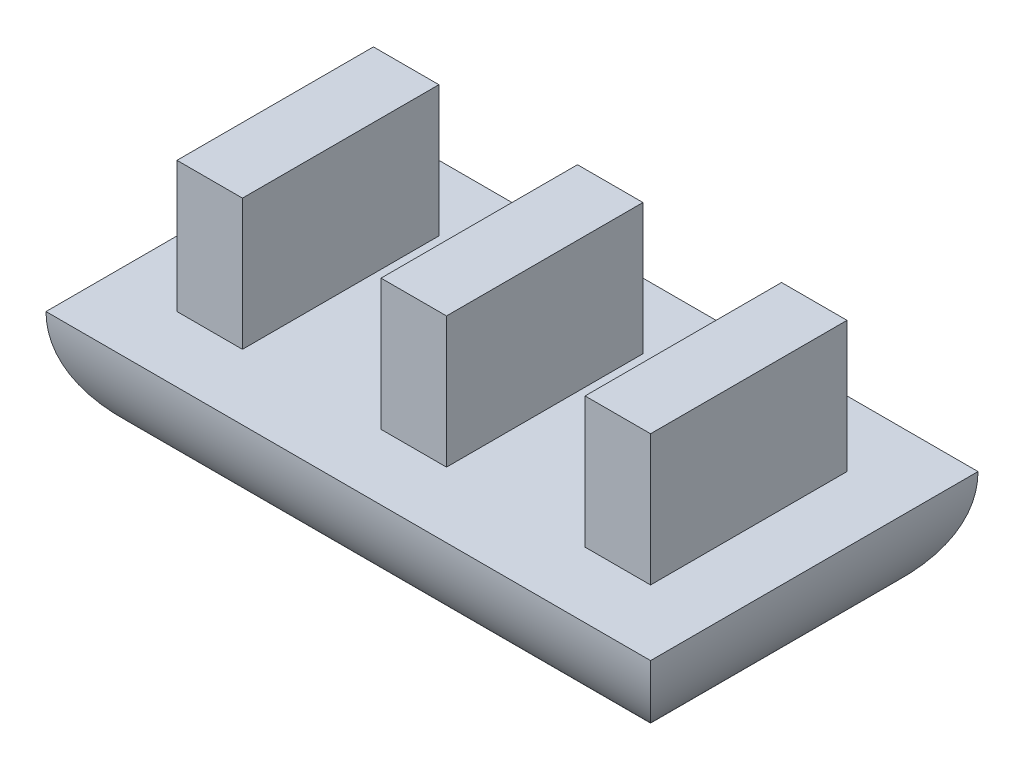
ISO-10303-21;
HEADER;
FILE_DESCRIPTION(('STEP AP214'),'2;1');
FILE_NAME('part.step','',(''),(''),'','','');
FILE_SCHEMA(('AUTOMOTIVE_DESIGN { 1 0 10303 214 1 1 1 1 }'));
ENDSEC;
DATA;
#1=APPLICATION_CONTEXT('core data for automotive mechanical design processes');
#2=APPLICATION_PROTOCOL_DEFINITION('international standard','automotive_design',2000,#1);
#3=PRODUCT_CONTEXT('',#1,'mechanical');
#4=PRODUCT('Part','Part','',(#3));
#5=PRODUCT_RELATED_PRODUCT_CATEGORY('part','',(#4));
#6=PRODUCT_DEFINITION_FORMATION('','',#4);
#7=PRODUCT_DEFINITION_CONTEXT('part definition',#1,'design');
#8=PRODUCT_DEFINITION('design','',#6,#7);
#9=PRODUCT_DEFINITION_SHAPE('','',#8);
#10=(LENGTH_UNIT() NAMED_UNIT(*) SI_UNIT(.MILLI.,.METRE.));
#11=(NAMED_UNIT(*) PLANE_ANGLE_UNIT() SI_UNIT($,.RADIAN.));
#12=(NAMED_UNIT(*) SI_UNIT($,.STERADIAN.) SOLID_ANGLE_UNIT());
#13=UNCERTAINTY_MEASURE_WITH_UNIT(LENGTH_MEASURE(1.E-05),#10,'distance_accuracy_value','');
#14=(GEOMETRIC_REPRESENTATION_CONTEXT(3) GLOBAL_UNCERTAINTY_ASSIGNED_CONTEXT((#13)) GLOBAL_UNIT_ASSIGNED_CONTEXT((#10,
#11,#12)) REPRESENTATION_CONTEXT('',''));
#15=CARTESIAN_POINT('',(0.,0.,0.));
#16=DIRECTION('',(0.,0.,1.));
#17=DIRECTION('',(1.,0.,0.));
#18=AXIS2_PLACEMENT_3D('',#15,#16,#17);
#19=CARTESIAN_POINT('',(0.,0.,0.));
#20=DIRECTION('',(0.,1.,0.));
#21=DIRECTION('',(0.,0.,1.));
#22=AXIS2_PLACEMENT_3D('',#19,#20,#21);
#23=PLANE('',#22);
#24=DIRECTION('',(1.,0.,0.));
#25=VECTOR('',#24,1.);
#26=CARTESIAN_POINT('',(0.,0.,0.));
#27=LINE('',#26,#25);
#28=CARTESIAN_POINT('',(0.,0.,0.));
#29=VERTEX_POINT('',#28);
#30=CARTESIAN_POINT('',(14.6558,0.,0.));
#31=VERTEX_POINT('',#30);
#32=EDGE_CURVE('E280',#29,#31,#27,.T.);
#33=ORIENTED_EDGE('',*,*,#32,.T.);
#34=DIRECTION('',(0.,0.,-1.));
#35=VECTOR('',#34,1.);
#36=CARTESIAN_POINT('',(14.6558,0.,0.));
#37=LINE('',#36,#35);
#38=CARTESIAN_POINT('',(14.6558,0.,-7.9375));
#39=VERTEX_POINT('',#38);
#40=EDGE_CURVE('E283',#31,#39,#37,.T.);
#41=ORIENTED_EDGE('',*,*,#40,.T.);
#42=DIRECTION('',(1.,0.,0.));
#43=VECTOR('',#42,1.);
#44=CARTESIAN_POINT('',(0.,0.,-7.9375));
#45=LINE('',#44,#43);
#46=CARTESIAN_POINT('',(0.,0.,-7.9375));
#47=VERTEX_POINT('',#46);
#48=EDGE_CURVE('E287',#47,#39,#45,.T.);
#49=ORIENTED_EDGE('',*,*,#48,.F.);
#50=DIRECTION('',(0.,0.,-1.));
#51=VECTOR('',#50,1.);
#52=CARTESIAN_POINT('',(0.,0.,0.));
#53=LINE('',#52,#51);
#54=EDGE_CURVE('E291',#29,#47,#53,.T.);
#55=ORIENTED_EDGE('',*,*,#54,.F.);
#56=EDGE_LOOP('',(#33,#41,#49,#55));
#57=FACE_BOUND('',#56,.T.);
#58=DIRECTION('',(0.,0.,-1.));
#59=VECTOR('',#58,1.);
#60=CARTESIAN_POINT('',(3.175,0.,0.));
#61=LINE('',#60,#59);
#62=CARTESIAN_POINT('',(3.175,0.,-1.5875));
#63=VERTEX_POINT('',#62);
#64=CARTESIAN_POINT('',(3.175,0.,-6.35));
#65=VERTEX_POINT('',#64);
#66=EDGE_CURVE('E256',#63,#65,#61,.T.);
#67=ORIENTED_EDGE('',*,*,#66,.F.);
#68=DIRECTION('',(1.,0.,0.));
#69=VECTOR('',#68,1.);
#70=CARTESIAN_POINT('',(0.,0.,-1.5875));
#71=LINE('',#70,#69);
#72=CARTESIAN_POINT('',(1.5875,0.,-1.5875));
#73=VERTEX_POINT('',#72);
#74=EDGE_CURVE('E235',#73,#63,#71,.T.);
#75=ORIENTED_EDGE('',*,*,#74,.F.);
#76=DIRECTION('',(0.,0.,-1.));
#77=VECTOR('',#76,1.);
#78=CARTESIAN_POINT('',(1.5875,0.,0.));
#79=LINE('',#78,#77);
#80=CARTESIAN_POINT('',(1.5875,0.,-6.35));
#81=VERTEX_POINT('',#80);
#82=EDGE_CURVE('E241',#73,#81,#79,.T.);
#83=ORIENTED_EDGE('',*,*,#82,.T.);
#84=DIRECTION('',(1.,0.,0.));
#85=VECTOR('',#84,1.);
#86=CARTESIAN_POINT('',(0.,0.,-6.35));
#87=LINE('',#86,#85);
#88=EDGE_CURVE('E260',#81,#65,#87,.T.);
#89=ORIENTED_EDGE('',*,*,#88,.T.);
#90=EDGE_LOOP('',(#67,#75,#83,#89));
#91=FACE_BOUND('',#90,.T.);
#92=DIRECTION('',(0.,0.,-1.));
#93=VECTOR('',#92,1.);
#94=CARTESIAN_POINT('',(8.12165,0.,0.));
#95=LINE('',#94,#93);
#96=CARTESIAN_POINT('',(8.12165,0.,-1.5875));
#97=VERTEX_POINT('',#96);
#98=CARTESIAN_POINT('',(8.12165,0.,-6.35));
#99=VERTEX_POINT('',#98);
#100=EDGE_CURVE('E189',#97,#99,#95,.T.);
#101=ORIENTED_EDGE('',*,*,#100,.F.);
#102=DIRECTION('',(1.,0.,0.));
#103=VECTOR('',#102,1.);
#104=CARTESIAN_POINT('',(0.,0.,-1.5875));
#105=LINE('',#104,#103);
#106=CARTESIAN_POINT('',(6.53415,0.,-1.5875));
#107=VERTEX_POINT('',#106);
#108=EDGE_CURVE('E184',#107,#97,#105,.T.);
#109=ORIENTED_EDGE('',*,*,#108,.F.);
#110=DIRECTION('',(0.,0.,-1.));
#111=VECTOR('',#110,1.);
#112=CARTESIAN_POINT('',(6.53415,0.,0.));
#113=LINE('',#112,#111);
#114=CARTESIAN_POINT('',(6.53415,0.,-6.35));
#115=VERTEX_POINT('',#114);
#116=EDGE_CURVE('E200',#107,#115,#113,.T.);
#117=ORIENTED_EDGE('',*,*,#116,.T.);
#118=DIRECTION('',(1.,0.,0.));
#119=VECTOR('',#118,1.);
#120=CARTESIAN_POINT('',(0.,0.,-6.35));
#121=LINE('',#120,#119);
#122=EDGE_CURVE('E215',#115,#99,#121,.T.);
#123=ORIENTED_EDGE('',*,*,#122,.T.);
#124=EDGE_LOOP('',(#101,#109,#117,#123));
#125=FACE_BOUND('',#124,.T.);
#126=DIRECTION('',(0.,0.,-1.));
#127=VECTOR('',#126,1.);
#128=CARTESIAN_POINT('',(13.0683,0.,0.));
#129=LINE('',#128,#127);
#130=CARTESIAN_POINT('',(13.0683,0.,-1.5875));
#131=VERTEX_POINT('',#130);
#132=CARTESIAN_POINT('',(13.0683,0.,-6.35));
#133=VERTEX_POINT('',#132);
#134=EDGE_CURVE('E318',#131,#133,#129,.T.);
#135=ORIENTED_EDGE('',*,*,#134,.F.);
#136=DIRECTION('',(1.,0.,0.));
#137=VECTOR('',#136,1.);
#138=CARTESIAN_POINT('',(0.,0.,-1.5875));
#139=LINE('',#138,#137);
#140=CARTESIAN_POINT('',(11.4808,0.,-1.5875));
#141=VERTEX_POINT('',#140);
#142=EDGE_CURVE('E182',#141,#131,#139,.T.);
#143=ORIENTED_EDGE('',*,*,#142,.F.);
#144=DIRECTION('',(0.,0.,-1.));
#145=VECTOR('',#144,1.);
#146=CARTESIAN_POINT('',(11.4808,0.,0.));
#147=LINE('',#146,#145);
#148=CARTESIAN_POINT('',(11.4808,0.,-6.35));
#149=VERTEX_POINT('',#148);
#150=EDGE_CURVE('E179',#141,#149,#147,.T.);
#151=ORIENTED_EDGE('',*,*,#150,.T.);
#152=DIRECTION('',(1.,0.,0.));
#153=VECTOR('',#152,1.);
#154=CARTESIAN_POINT('',(0.,0.,-6.35));
#155=LINE('',#154,#153);
#156=EDGE_CURVE('E321',#149,#133,#155,.T.);
#157=ORIENTED_EDGE('',*,*,#156,.T.);
#158=EDGE_LOOP('',(#135,#143,#151,#157));
#159=FACE_BOUND('',#158,.T.);
#160=ADVANCED_FACE('F41',(#57,#91,#125,#159),#23,.T.);
#161=CARTESIAN_POINT('',(0.,-3.175,0.));
#162=DIRECTION('',(0.,1.,0.));
#163=DIRECTION('',(0.,0.,1.));
#164=AXIS2_PLACEMENT_3D('',#161,#162,#163);
#165=PLANE('',#164);
#166=DIRECTION('',(1.,0.,0.));
#167=VECTOR('',#166,1.);
#168=CARTESIAN_POINT('',(0.,-3.175,-4.7625));
#169=LINE('',#168,#167);
#170=CARTESIAN_POINT('',(3.175,-3.175,-4.7625));
#171=VERTEX_POINT('',#170);
#172=CARTESIAN_POINT('',(11.4808,-3.175,-4.7625));
#173=VERTEX_POINT('',#172);
#174=EDGE_CURVE('E51',#171,#173,#169,.T.);
#175=ORIENTED_EDGE('',*,*,#174,.T.);
#176=DIRECTION('',(0.,0.,-1.));
#177=VECTOR('',#176,1.);
#178=CARTESIAN_POINT('',(11.4808,-3.175,0.));
#179=LINE('',#178,#177);
#180=CARTESIAN_POINT('',(11.4808,-3.175,-3.175));
#181=VERTEX_POINT('',#180);
#182=EDGE_CURVE('E11',#173,#181,#179,.F.);
#183=ORIENTED_EDGE('',*,*,#182,.T.);
#184=DIRECTION('',(1.,0.,0.));
#185=VECTOR('',#184,1.);
#186=CARTESIAN_POINT('',(0.,-3.175,-3.175));
#187=LINE('',#186,#185);
#188=CARTESIAN_POINT('',(3.175,-3.175,-3.175));
#189=VERTEX_POINT('',#188);
#190=EDGE_CURVE('E295',#181,#189,#187,.F.);
#191=ORIENTED_EDGE('',*,*,#190,.T.);
#192=DIRECTION('',(0.,0.,-1.));
#193=VECTOR('',#192,1.);
#194=CARTESIAN_POINT('',(3.175,-3.175,0.));
#195=LINE('',#194,#193);
#196=EDGE_CURVE('E62',#189,#171,#195,.T.);
#197=ORIENTED_EDGE('',*,*,#196,.T.);
#198=EDGE_LOOP('',(#175,#183,#191,#197));
#199=FACE_BOUND('',#198,.T.);
#200=ADVANCED_FACE('F342',(#199),#165,.F.);
#201=CARTESIAN_POINT('',(0.,3.175,-1.5875));
#202=DIRECTION('',(0.,0.,-1.));
#203=DIRECTION('',(-1.,0.,0.));
#204=AXIS2_PLACEMENT_3D('',#201,#202,#203);
#205=PLANE('',#204);
#206=ORIENTED_EDGE('',*,*,#74,.T.);
#207=DIRECTION('',(0.,-1.,0.));
#208=VECTOR('',#207,1.);
#209=CARTESIAN_POINT('',(3.175,3.175,-1.5875));
#210=LINE('',#209,#208);
#211=CARTESIAN_POINT('',(3.175,3.175,-1.5875));
#212=VERTEX_POINT('',#211);
#213=EDGE_CURVE('E276',#212,#63,#210,.T.);
#214=ORIENTED_EDGE('',*,*,#213,.F.);
#215=DIRECTION('',(1.,0.,0.));
#216=VECTOR('',#215,1.);
#217=CARTESIAN_POINT('',(0.,3.175,-1.5875));
#218=LINE('',#217,#216);
#219=CARTESIAN_POINT('',(1.5875,3.175,-1.5875));
#220=VERTEX_POINT('',#219);
#221=EDGE_CURVE('E236',#220,#212,#218,.T.);
#222=ORIENTED_EDGE('',*,*,#221,.F.);
#223=DIRECTION('',(0.,-1.,0.));
#224=VECTOR('',#223,1.);
#225=CARTESIAN_POINT('',(1.5875,3.175,-1.5875));
#226=LINE('',#225,#224);
#227=EDGE_CURVE('E252',#220,#73,#226,.T.);
#228=ORIENTED_EDGE('',*,*,#227,.T.);
#229=EDGE_LOOP('',(#206,#214,#222,#228));
#230=FACE_BOUND('',#229,.T.);
#231=ADVANCED_FACE('F348',(#230),#205,.F.);
#232=CARTESIAN_POINT('',(3.175,3.175,0.));
#233=DIRECTION('',(-1.,0.,0.));
#234=DIRECTION('',(0.,0.,1.));
#235=AXIS2_PLACEMENT_3D('',#232,#233,#234);
#236=PLANE('',#235);
#237=ORIENTED_EDGE('',*,*,#66,.T.);
#238=DIRECTION('',(0.,-1.,0.));
#239=VECTOR('',#238,1.);
#240=CARTESIAN_POINT('',(3.175,3.175,-6.35));
#241=LINE('',#240,#239);
#242=CARTESIAN_POINT('',(3.175,3.175,-6.35));
#243=VERTEX_POINT('',#242);
#244=EDGE_CURVE('E272',#243,#65,#241,.T.);
#245=ORIENTED_EDGE('',*,*,#244,.F.);
#246=DIRECTION('',(0.,0.,-1.));
#247=VECTOR('',#246,1.);
#248=CARTESIAN_POINT('',(3.175,3.175,0.));
#249=LINE('',#248,#247);
#250=EDGE_CURVE('E240',#212,#243,#249,.T.);
#251=ORIENTED_EDGE('',*,*,#250,.F.);
#252=ORIENTED_EDGE('',*,*,#213,.T.);
#253=EDGE_LOOP('',(#237,#245,#251,#252));
#254=FACE_BOUND('',#253,.T.);
#255=ADVANCED_FACE('F414',(#254),#236,.F.);
#256=CARTESIAN_POINT('',(0.,3.175,-6.35));
#257=DIRECTION('',(0.,0.,-1.));
#258=DIRECTION('',(-1.,0.,0.));
#259=AXIS2_PLACEMENT_3D('',#256,#257,#258);
#260=PLANE('',#259);
#261=ORIENTED_EDGE('',*,*,#88,.F.);
#262=DIRECTION('',(0.,-1.,0.));
#263=VECTOR('',#262,1.);
#264=CARTESIAN_POINT('',(1.5875,3.175,-6.35));
#265=LINE('',#264,#263);
#266=CARTESIAN_POINT('',(1.5875,3.175,-6.35));
#267=VERTEX_POINT('',#266);
#268=EDGE_CURVE('E268',#267,#81,#265,.T.);
#269=ORIENTED_EDGE('',*,*,#268,.F.);
#270=DIRECTION('',(1.,0.,0.));
#271=VECTOR('',#270,1.);
#272=CARTESIAN_POINT('',(0.,3.175,-6.35));
#273=LINE('',#272,#271);
#274=EDGE_CURVE('E244',#267,#243,#273,.T.);
#275=ORIENTED_EDGE('',*,*,#274,.T.);
#276=ORIENTED_EDGE('',*,*,#244,.T.);
#277=EDGE_LOOP('',(#261,#269,#275,#276));
#278=FACE_BOUND('',#277,.T.);
#279=ADVANCED_FACE('F410',(#278),#260,.T.);
#280=CARTESIAN_POINT('',(1.5875,3.175,0.));
#281=DIRECTION('',(-1.,0.,0.));
#282=DIRECTION('',(0.,0.,1.));
#283=AXIS2_PLACEMENT_3D('',#280,#281,#282);
#284=PLANE('',#283);
#285=ORIENTED_EDGE('',*,*,#82,.F.);
#286=ORIENTED_EDGE('',*,*,#227,.F.);
#287=DIRECTION('',(0.,0.,-1.));
#288=VECTOR('',#287,1.);
#289=CARTESIAN_POINT('',(1.5875,3.175,0.));
#290=LINE('',#289,#288);
#291=EDGE_CURVE('E248',#220,#267,#290,.T.);
#292=ORIENTED_EDGE('',*,*,#291,.T.);
#293=ORIENTED_EDGE('',*,*,#268,.T.);
#294=EDGE_LOOP('',(#285,#286,#292,#293));
#295=FACE_BOUND('',#294,.T.);
#296=ADVANCED_FACE('F406',(#295),#284,.T.);
#297=CARTESIAN_POINT('',(0.,3.175,0.));
#298=DIRECTION('',(0.,1.,0.));
#299=DIRECTION('',(0.,0.,1.));
#300=AXIS2_PLACEMENT_3D('',#297,#298,#299);
#301=PLANE('',#300);
#302=ORIENTED_EDGE('',*,*,#221,.T.);
#303=ORIENTED_EDGE('',*,*,#250,.T.);
#304=ORIENTED_EDGE('',*,*,#274,.F.);
#305=ORIENTED_EDGE('',*,*,#291,.F.);
#306=EDGE_LOOP('',(#302,#303,#304,#305));
#307=FACE_BOUND('',#306,.T.);
#308=ADVANCED_FACE('F402',(#307),#301,.T.);
#309=CARTESIAN_POINT('',(0.,3.175,-1.5875));
#310=DIRECTION('',(0.,0.,-1.));
#311=DIRECTION('',(-1.,0.,0.));
#312=AXIS2_PLACEMENT_3D('',#309,#310,#311);
#313=PLANE('',#312);
#314=ORIENTED_EDGE('',*,*,#108,.T.);
#315=DIRECTION('',(0.,-1.,0.));
#316=VECTOR('',#315,1.);
#317=CARTESIAN_POINT('',(8.12165,3.175,-1.5875));
#318=LINE('',#317,#316);
#319=CARTESIAN_POINT('',(8.12165,3.175,-1.5875));
#320=VERTEX_POINT('',#319);
#321=EDGE_CURVE('E231',#320,#97,#318,.T.);
#322=ORIENTED_EDGE('',*,*,#321,.F.);
#323=DIRECTION('',(1.,0.,0.));
#324=VECTOR('',#323,1.);
#325=CARTESIAN_POINT('',(0.,3.175,-1.5875));
#326=LINE('',#325,#324);
#327=CARTESIAN_POINT('',(6.53415,3.175,-1.5875));
#328=VERTEX_POINT('',#327);
#329=EDGE_CURVE('E195',#328,#320,#326,.T.);
#330=ORIENTED_EDGE('',*,*,#329,.F.);
#331=DIRECTION('',(0.,-1.,0.));
#332=VECTOR('',#331,1.);
#333=CARTESIAN_POINT('',(6.53415,3.175,-1.5875));
#334=LINE('',#333,#332);
#335=EDGE_CURVE('E210',#328,#107,#334,.T.);
#336=ORIENTED_EDGE('',*,*,#335,.T.);
#337=EDGE_LOOP('',(#314,#322,#330,#336));
#338=FACE_BOUND('',#337,.T.);
#339=ADVANCED_FACE('F398',(#338),#313,.F.);
#340=CARTESIAN_POINT('',(8.12165,3.175,0.));
#341=DIRECTION('',(-1.,0.,0.));
#342=DIRECTION('',(0.,0.,1.));
#343=AXIS2_PLACEMENT_3D('',#340,#341,#342);
#344=PLANE('',#343);
#345=ORIENTED_EDGE('',*,*,#100,.T.);
#346=DIRECTION('',(0.,-1.,0.));
#347=VECTOR('',#346,1.);
#348=CARTESIAN_POINT('',(8.12165,3.175,-6.35));
#349=LINE('',#348,#347);
#350=CARTESIAN_POINT('',(8.12165,3.175,-6.35));
#351=VERTEX_POINT('',#350);
#352=EDGE_CURVE('E227',#351,#99,#349,.T.);
#353=ORIENTED_EDGE('',*,*,#352,.F.);
#354=DIRECTION('',(0.,0.,-1.));
#355=VECTOR('',#354,1.);
#356=CARTESIAN_POINT('',(8.12165,3.175,0.));
#357=LINE('',#356,#355);
#358=EDGE_CURVE('E199',#320,#351,#357,.T.);
#359=ORIENTED_EDGE('',*,*,#358,.F.);
#360=ORIENTED_EDGE('',*,*,#321,.T.);
#361=EDGE_LOOP('',(#345,#353,#359,#360));
#362=FACE_BOUND('',#361,.T.);
#363=ADVANCED_FACE('F394',(#362),#344,.F.);
#364=CARTESIAN_POINT('',(0.,3.175,-6.35));
#365=DIRECTION('',(0.,0.,-1.));
#366=DIRECTION('',(-1.,0.,0.));
#367=AXIS2_PLACEMENT_3D('',#364,#365,#366);
#368=PLANE('',#367);
#369=ORIENTED_EDGE('',*,*,#122,.F.);
#370=DIRECTION('',(0.,-1.,0.));
#371=VECTOR('',#370,1.);
#372=CARTESIAN_POINT('',(6.53415,3.175,-6.35));
#373=LINE('',#372,#371);
#374=CARTESIAN_POINT('',(6.53415,3.175,-6.35));
#375=VERTEX_POINT('',#374);
#376=EDGE_CURVE('E223',#375,#115,#373,.T.);
#377=ORIENTED_EDGE('',*,*,#376,.F.);
#378=DIRECTION('',(1.,0.,0.));
#379=VECTOR('',#378,1.);
#380=CARTESIAN_POINT('',(0.,3.175,-6.35));
#381=LINE('',#380,#379);
#382=EDGE_CURVE('E203',#375,#351,#381,.T.);
#383=ORIENTED_EDGE('',*,*,#382,.T.);
#384=ORIENTED_EDGE('',*,*,#352,.T.);
#385=EDGE_LOOP('',(#369,#377,#383,#384));
#386=FACE_BOUND('',#385,.T.);
#387=ADVANCED_FACE('F390',(#386),#368,.T.);
#388=CARTESIAN_POINT('',(6.53415,3.175,0.));
#389=DIRECTION('',(-1.,0.,0.));
#390=DIRECTION('',(0.,0.,1.));
#391=AXIS2_PLACEMENT_3D('',#388,#389,#390);
#392=PLANE('',#391);
#393=ORIENTED_EDGE('',*,*,#116,.F.);
#394=ORIENTED_EDGE('',*,*,#335,.F.);
#395=DIRECTION('',(0.,0.,-1.));
#396=VECTOR('',#395,1.);
#397=CARTESIAN_POINT('',(6.53415,3.175,0.));
#398=LINE('',#397,#396);
#399=EDGE_CURVE('E207',#328,#375,#398,.T.);
#400=ORIENTED_EDGE('',*,*,#399,.T.);
#401=ORIENTED_EDGE('',*,*,#376,.T.);
#402=EDGE_LOOP('',(#393,#394,#400,#401));
#403=FACE_BOUND('',#402,.T.);
#404=ADVANCED_FACE('F386',(#403),#392,.T.);
#405=CARTESIAN_POINT('',(0.,3.175,0.));
#406=DIRECTION('',(0.,1.,0.));
#407=DIRECTION('',(0.,0.,1.));
#408=AXIS2_PLACEMENT_3D('',#405,#406,#407);
#409=PLANE('',#408);
#410=ORIENTED_EDGE('',*,*,#329,.T.);
#411=ORIENTED_EDGE('',*,*,#358,.T.);
#412=ORIENTED_EDGE('',*,*,#382,.F.);
#413=ORIENTED_EDGE('',*,*,#399,.F.);
#414=EDGE_LOOP('',(#410,#411,#412,#413));
#415=FACE_BOUND('',#414,.T.);
#416=ADVANCED_FACE('F383',(#415),#409,.T.);
#417=CARTESIAN_POINT('',(0.,3.175,-1.5875));
#418=DIRECTION('',(0.,0.,-1.));
#419=DIRECTION('',(-1.,0.,0.));
#420=AXIS2_PLACEMENT_3D('',#417,#418,#419);
#421=PLANE('',#420);
#422=ORIENTED_EDGE('',*,*,#142,.T.);
#423=DIRECTION('',(0.,-1.,0.));
#424=VECTOR('',#423,1.);
#425=CARTESIAN_POINT('',(13.0683,3.175,-1.5875));
#426=LINE('',#425,#424);
#427=CARTESIAN_POINT('',(13.0683,3.175,-1.5875));
#428=VERTEX_POINT('',#427);
#429=EDGE_CURVE('E160',#428,#131,#426,.T.);
#430=ORIENTED_EDGE('',*,*,#429,.F.);
#431=DIRECTION('',(1.,0.,0.));
#432=VECTOR('',#431,1.);
#433=CARTESIAN_POINT('',(0.,3.175,-1.5875));
#434=LINE('',#433,#432);
#435=CARTESIAN_POINT('',(11.4808,3.175,-1.5875));
#436=VERTEX_POINT('',#435);
#437=EDGE_CURVE('E169',#436,#428,#434,.T.);
#438=ORIENTED_EDGE('',*,*,#437,.F.);
#439=DIRECTION('',(0.,-1.,0.));
#440=VECTOR('',#439,1.);
#441=CARTESIAN_POINT('',(11.4808,3.175,-1.5875));
#442=LINE('',#441,#440);
#443=EDGE_CURVE('E330',#436,#141,#442,.T.);
#444=ORIENTED_EDGE('',*,*,#443,.T.);
#445=EDGE_LOOP('',(#422,#430,#438,#444));
#446=FACE_BOUND('',#445,.T.);
#447=ADVANCED_FACE('F181',(#446),#421,.F.);
#448=CARTESIAN_POINT('',(13.0683,3.175,0.));
#449=DIRECTION('',(-1.,0.,0.));
#450=DIRECTION('',(0.,0.,1.));
#451=AXIS2_PLACEMENT_3D('',#448,#449,#450);
#452=PLANE('',#451);
#453=ORIENTED_EDGE('',*,*,#134,.T.);
#454=DIRECTION('',(0.,-1.,0.));
#455=VECTOR('',#454,1.);
#456=CARTESIAN_POINT('',(13.0683,3.175,-6.35));
#457=LINE('',#456,#455);
#458=CARTESIAN_POINT('',(13.0683,3.175,-6.35));
#459=VERTEX_POINT('',#458);
#460=EDGE_CURVE('E163',#459,#133,#457,.T.);
#461=ORIENTED_EDGE('',*,*,#460,.F.);
#462=DIRECTION('',(0.,0.,-1.));
#463=VECTOR('',#462,1.);
#464=CARTESIAN_POINT('',(13.0683,3.175,0.));
#465=LINE('',#464,#463);
#466=EDGE_CURVE('E155',#428,#459,#465,.T.);
#467=ORIENTED_EDGE('',*,*,#466,.F.);
#468=ORIENTED_EDGE('',*,*,#429,.T.);
#469=EDGE_LOOP('',(#453,#461,#467,#468));
#470=FACE_BOUND('',#469,.T.);
#471=ADVANCED_FACE('F158',(#470),#452,.F.);
#472=CARTESIAN_POINT('',(0.,3.175,-6.35));
#473=DIRECTION('',(0.,0.,-1.));
#474=DIRECTION('',(-1.,0.,0.));
#475=AXIS2_PLACEMENT_3D('',#472,#473,#474);
#476=PLANE('',#475);
#477=ORIENTED_EDGE('',*,*,#156,.F.);
#478=DIRECTION('',(0.,-1.,0.));
#479=VECTOR('',#478,1.);
#480=CARTESIAN_POINT('',(11.4808,3.175,-6.35));
#481=LINE('',#480,#479);
#482=CARTESIAN_POINT('',(11.4808,3.175,-6.35));
#483=VERTEX_POINT('',#482);
#484=EDGE_CURVE('E191',#483,#149,#481,.T.);
#485=ORIENTED_EDGE('',*,*,#484,.F.);
#486=DIRECTION('',(1.,0.,0.));
#487=VECTOR('',#486,1.);
#488=CARTESIAN_POINT('',(0.,3.175,-6.35));
#489=LINE('',#488,#487);
#490=EDGE_CURVE('E168',#483,#459,#489,.T.);
#491=ORIENTED_EDGE('',*,*,#490,.T.);
#492=ORIENTED_EDGE('',*,*,#460,.T.);
#493=EDGE_LOOP('',(#477,#485,#491,#492));
#494=FACE_BOUND('',#493,.T.);
#495=ADVANCED_FACE('F339',(#494),#476,.T.);
#496=CARTESIAN_POINT('',(11.4808,3.175,0.));
#497=DIRECTION('',(-1.,0.,0.));
#498=DIRECTION('',(0.,0.,1.));
#499=AXIS2_PLACEMENT_3D('',#496,#497,#498);
#500=PLANE('',#499);
#501=ORIENTED_EDGE('',*,*,#150,.F.);
#502=ORIENTED_EDGE('',*,*,#443,.F.);
#503=DIRECTION('',(0.,0.,-1.));
#504=VECTOR('',#503,1.);
#505=CARTESIAN_POINT('',(11.4808,3.175,0.));
#506=LINE('',#505,#504);
#507=EDGE_CURVE('E175',#436,#483,#506,.T.);
#508=ORIENTED_EDGE('',*,*,#507,.T.);
#509=ORIENTED_EDGE('',*,*,#484,.T.);
#510=EDGE_LOOP('',(#501,#502,#508,#509));
#511=FACE_BOUND('',#510,.T.);
#512=ADVANCED_FACE('F337',(#511),#500,.T.);
#513=CARTESIAN_POINT('',(0.,3.175,0.));
#514=DIRECTION('',(0.,1.,0.));
#515=DIRECTION('',(0.,0.,1.));
#516=AXIS2_PLACEMENT_3D('',#513,#514,#515);
#517=PLANE('',#516);
#518=ORIENTED_EDGE('',*,*,#437,.T.);
#519=ORIENTED_EDGE('',*,*,#466,.T.);
#520=ORIENTED_EDGE('',*,*,#490,.F.);
#521=ORIENTED_EDGE('',*,*,#507,.F.);
#522=EDGE_LOOP('',(#518,#519,#520,#521));
#523=FACE_BOUND('',#522,.T.);
#524=ADVANCED_FACE('F173',(#523),#517,.T.);
#525=CARTESIAN_POINT('',(3.175,0.,0.));
#526=DIRECTION('',(0.,0.,-1.));
#527=DIRECTION('',(-1.,0.,0.));
#528=AXIS2_PLACEMENT_3D('',#525,#526,#527);
#529=CYLINDRICAL_SURFACE('',#528,3.175);
#530=CARTESIAN_POINT('',(3.175,0.,-4.7625));
#531=DIRECTION('',(0.707106781186547,0.,-0.707106781186547));
#532=DIRECTION('',(-0.707106781186547,0.,-0.707106781186547));
#533=AXIS2_PLACEMENT_3D('',#530,#531,#532);
#534=ELLIPSE('',#533,4.49012806053458,3.175);
#535=EDGE_CURVE('E307',#171,#47,#534,.T.);
#536=ORIENTED_EDGE('',*,*,#535,.F.);
#537=ORIENTED_EDGE('',*,*,#196,.F.);
#538=CARTESIAN_POINT('',(3.175,0.,-3.175));
#539=DIRECTION('',(-0.707106781186547,0.,-0.707106781186547));
#540=DIRECTION('',(-0.707106781186547,0.,0.707106781186547));
#541=AXIS2_PLACEMENT_3D('',#538,#539,#540);
#542=ELLIPSE('',#541,4.49012806053458,3.175);
#543=EDGE_CURVE('E45',#29,#189,#542,.F.);
#544=ORIENTED_EDGE('',*,*,#543,.F.);
#545=ORIENTED_EDGE('',*,*,#54,.T.);
#546=EDGE_LOOP('',(#536,#537,#544,#545));
#547=FACE_BOUND('',#546,.T.);
#548=ADVANCED_FACE('F43',(#547),#529,.T.);
#549=CARTESIAN_POINT('',(0.,0.,-3.175));
#550=DIRECTION('',(-1.,0.,0.));
#551=DIRECTION('',(0.,0.,1.));
#552=AXIS2_PLACEMENT_3D('',#549,#550,#551);
#553=CYLINDRICAL_SURFACE('',#552,3.175);
#554=ORIENTED_EDGE('',*,*,#543,.T.);
#555=ORIENTED_EDGE('',*,*,#190,.F.);
#556=CARTESIAN_POINT('',(11.4808,0.,-3.175));
#557=DIRECTION('',(-0.707106781186547,0.,0.707106781186547));
#558=DIRECTION('',(-0.707106781186547,0.,-0.707106781186547));
#559=AXIS2_PLACEMENT_3D('',#556,#557,#558);
#560=ELLIPSE('',#559,4.49012806053458,3.175);
#561=EDGE_CURVE('E305',#31,#181,#560,.F.);
#562=ORIENTED_EDGE('',*,*,#561,.F.);
#563=ORIENTED_EDGE('',*,*,#32,.F.);
#564=EDGE_LOOP('',(#554,#555,#562,#563));
#565=FACE_BOUND('',#564,.T.);
#566=ADVANCED_FACE('F359',(#565),#553,.T.);
#567=CARTESIAN_POINT('',(0.,0.,-4.7625));
#568=DIRECTION('',(1.,0.,0.));
#569=DIRECTION('',(0.,0.,-1.));
#570=AXIS2_PLACEMENT_3D('',#567,#568,#569);
#571=CYLINDRICAL_SURFACE('',#570,3.175);
#572=ORIENTED_EDGE('',*,*,#535,.T.);
#573=ORIENTED_EDGE('',*,*,#48,.T.);
#574=CARTESIAN_POINT('',(11.4808,0.,-4.7625));
#575=DIRECTION('',(0.707106781186547,0.,0.707106781186547));
#576=DIRECTION('',(0.707106781186547,0.,-0.707106781186547));
#577=AXIS2_PLACEMENT_3D('',#574,#575,#576);
#578=ELLIPSE('',#577,4.49012806053458,3.175);
#579=EDGE_CURVE('E302',#173,#39,#578,.T.);
#580=ORIENTED_EDGE('',*,*,#579,.F.);
#581=ORIENTED_EDGE('',*,*,#174,.F.);
#582=EDGE_LOOP('',(#572,#573,#580,#581));
#583=FACE_BOUND('',#582,.T.);
#584=ADVANCED_FACE('F356',(#583),#571,.T.);
#585=CARTESIAN_POINT('',(11.4808,0.,0.));
#586=DIRECTION('',(0.,0.,1.));
#587=DIRECTION('',(1.,0.,0.));
#588=AXIS2_PLACEMENT_3D('',#585,#586,#587);
#589=CYLINDRICAL_SURFACE('',#588,3.175);
#590=ORIENTED_EDGE('',*,*,#561,.T.);
#591=ORIENTED_EDGE('',*,*,#182,.F.);
#592=ORIENTED_EDGE('',*,*,#579,.T.);
#593=ORIENTED_EDGE('',*,*,#40,.F.);
#594=EDGE_LOOP('',(#590,#591,#592,#593));
#595=FACE_BOUND('',#594,.T.);
#596=ADVANCED_FACE('F353',(#595),#589,.T.);
#597=CLOSED_SHELL('',(#160,#200,#231,#255,#279,#296,#308,#339,#363,#387,#404,#416,#447,#471,
#495,#512,#524,#548,#566,#584,#596));
#598=MANIFOLD_SOLID_BREP('B2',#597);
#599=ADVANCED_BREP_SHAPE_REPRESENTATION('',(#18,#598),#14);
#600=SHAPE_DEFINITION_REPRESENTATION(#9,#599);
ENDSEC;
END-ISO-10303-21;
